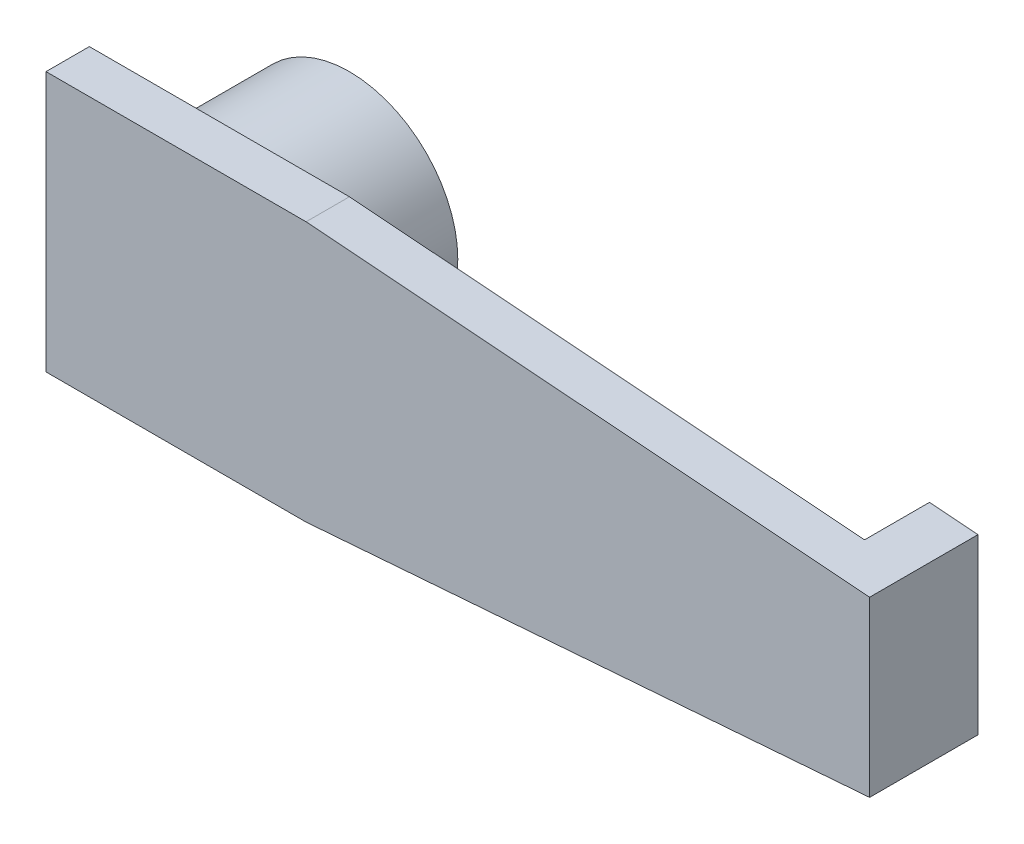
ISO-10303-21;
HEADER;
FILE_DESCRIPTION(('STEP AP214'),'2;1');
FILE_NAME('part.step','',(''),(''),'','','');
FILE_SCHEMA(('AUTOMOTIVE_DESIGN { 1 0 10303 214 1 1 1 1 }'));
ENDSEC;
DATA;
#1=APPLICATION_CONTEXT('core data for automotive mechanical design processes');
#2=APPLICATION_PROTOCOL_DEFINITION('international standard','automotive_design',2000,#1);
#3=PRODUCT_CONTEXT('',#1,'mechanical');
#4=PRODUCT('Part','Part','',(#3));
#5=PRODUCT_RELATED_PRODUCT_CATEGORY('part','',(#4));
#6=PRODUCT_DEFINITION_FORMATION('','',#4);
#7=PRODUCT_DEFINITION_CONTEXT('part definition',#1,'design');
#8=PRODUCT_DEFINITION('design','',#6,#7);
#9=PRODUCT_DEFINITION_SHAPE('','',#8);
#10=(LENGTH_UNIT() NAMED_UNIT(*) SI_UNIT(.MILLI.,.METRE.));
#11=(NAMED_UNIT(*) PLANE_ANGLE_UNIT() SI_UNIT($,.RADIAN.));
#12=(NAMED_UNIT(*) SI_UNIT($,.STERADIAN.) SOLID_ANGLE_UNIT());
#13=UNCERTAINTY_MEASURE_WITH_UNIT(LENGTH_MEASURE(1.E-05),#10,'distance_accuracy_value','');
#14=(GEOMETRIC_REPRESENTATION_CONTEXT(3) GLOBAL_UNCERTAINTY_ASSIGNED_CONTEXT((#13)) GLOBAL_UNIT_ASSIGNED_CONTEXT((#10,
#11,#12)) REPRESENTATION_CONTEXT('',''));
#15=CARTESIAN_POINT('',(0.,0.,0.));
#16=DIRECTION('',(0.,0.,1.));
#17=DIRECTION('',(1.,0.,0.));
#18=AXIS2_PLACEMENT_3D('',#15,#16,#17);
#19=CARTESIAN_POINT('',(0.,0.,15.));
#20=DIRECTION('',(0.,0.,1.));
#21=DIRECTION('',(1.,0.,0.));
#22=AXIS2_PLACEMENT_3D('',#19,#20,#21);
#23=PLANE('',#22);
#24=CARTESIAN_POINT('',(0.,0.,15.));
#25=DIRECTION('',(0.,0.,1.));
#26=DIRECTION('',(1.,0.,0.));
#27=AXIS2_PLACEMENT_3D('',#24,#25,#26);
#28=CIRCLE('',#27,12.5);
#29=CARTESIAN_POINT('',(12.5,0.,15.));
#30=VERTEX_POINT('',#29);
#31=EDGE_CURVE('E12',#30,#30,#28,.T.);
#32=ORIENTED_EDGE('',*,*,#31,.T.);
#33=EDGE_LOOP('',(#32));
#34=FACE_BOUND('',#33,.T.);
#35=DIRECTION('',(0.,1.,0.));
#36=VECTOR('',#35,1.);
#37=CARTESIAN_POINT('',(74.407472360814,10.4301944337835,15.));
#38=LINE('',#37,#36);
#39=CARTESIAN_POINT('',(74.407472360814,-10.4301944337835,15.));
#40=VERTEX_POINT('',#39);
#41=CARTESIAN_POINT('',(74.407472360814,10.4301944337835,15.));
#42=VERTEX_POINT('',#41);
#43=EDGE_CURVE('E366',#40,#42,#38,.T.);
#44=ORIENTED_EDGE('',*,*,#43,.F.);
#45=DIRECTION('',(0.997054485501581,0.0766964988847371,0.));
#46=VECTOR('',#45,1.);
#47=CARTESIAN_POINT('',(15.,-15.,15.));
#48=LINE('',#47,#46);
#49=CARTESIAN_POINT('',(15.0000000000003,-15.,15.));
#50=VERTEX_POINT('',#49);
#51=EDGE_CURVE('E170',#50,#40,#48,.T.);
#52=ORIENTED_EDGE('',*,*,#51,.F.);
#53=DIRECTION('',(1.,0.,0.));
#54=VECTOR('',#53,1.);
#55=CARTESIAN_POINT('',(-15.,-15.,15.));
#56=LINE('',#55,#54);
#57=CARTESIAN_POINT('',(-15.,-15.,15.));
#58=VERTEX_POINT('',#57);
#59=EDGE_CURVE('E103',#58,#50,#56,.T.);
#60=ORIENTED_EDGE('',*,*,#59,.F.);
#61=DIRECTION('',(0.,-1.,0.));
#62=VECTOR('',#61,1.);
#63=CARTESIAN_POINT('',(-15.,15.,15.));
#64=LINE('',#63,#62);
#65=CARTESIAN_POINT('',(-15.,15.,15.));
#66=VERTEX_POINT('',#65);
#67=EDGE_CURVE('E151',#66,#58,#64,.T.);
#68=ORIENTED_EDGE('',*,*,#67,.F.);
#69=DIRECTION('',(-1.,0.,0.));
#70=VECTOR('',#69,1.);
#71=CARTESIAN_POINT('',(-15.,15.,15.));
#72=LINE('',#71,#70);
#73=CARTESIAN_POINT('',(15.0000000000005,15.,15.));
#74=VERTEX_POINT('',#73);
#75=EDGE_CURVE('E248',#74,#66,#72,.T.);
#76=ORIENTED_EDGE('',*,*,#75,.F.);
#77=DIRECTION('',(0.997054485501581,-0.076696498884737,0.));
#78=VECTOR('',#77,1.);
#79=CARTESIAN_POINT('',(15.,15.,15.));
#80=LINE('',#79,#78);
#81=EDGE_CURVE('E162',#74,#42,#80,.T.);
#82=ORIENTED_EDGE('',*,*,#81,.T.);
#83=EDGE_LOOP('',(#44,#52,#60,#68,#76,#82));
#84=FACE_BOUND('',#83,.T.);
#85=ADVANCED_FACE('F49',(#34,#84),#23,.F.);
#86=CARTESIAN_POINT('',(0.,0.,15.));
#87=DIRECTION('',(0.,0.,-1.));
#88=DIRECTION('',(-1.,0.,0.));
#89=AXIS2_PLACEMENT_3D('',#86,#87,#88);
#90=CYLINDRICAL_SURFACE('',#89,12.5);
#91=ORIENTED_EDGE('',*,*,#31,.F.);
#92=EDGE_LOOP('',(#91));
#93=FACE_BOUND('',#92,.T.);
#94=CARTESIAN_POINT('',(0.,0.,0.));
#95=DIRECTION('',(0.,0.,1.));
#96=DIRECTION('',(1.,0.,0.));
#97=AXIS2_PLACEMENT_3D('',#94,#95,#96);
#98=CIRCLE('',#97,12.5);
#99=CARTESIAN_POINT('',(12.5,0.,0.));
#100=VERTEX_POINT('',#99);
#101=EDGE_CURVE('E60',#100,#100,#98,.T.);
#102=ORIENTED_EDGE('',*,*,#101,.T.);
#103=EDGE_LOOP('',(#102));
#104=FACE_BOUND('',#103,.T.);
#105=ADVANCED_FACE('F51',(#93,#104),#90,.T.);
#106=CARTESIAN_POINT('',(0.,0.,0.));
#107=DIRECTION('',(0.,0.,1.));
#108=DIRECTION('',(1.,0.,0.));
#109=AXIS2_PLACEMENT_3D('',#106,#107,#108);
#110=PLANE('',#109);
#111=DIRECTION('',(-1.,0.,0.));
#112=VECTOR('',#111,1.);
#113=CARTESIAN_POINT('',(5.,-5.,0.));
#114=LINE('',#113,#112);
#115=CARTESIAN_POINT('',(5.,-5.,0.));
#116=VERTEX_POINT('',#115);
#117=CARTESIAN_POINT('',(-5.,-5.,0.));
#118=VERTEX_POINT('',#117);
#119=EDGE_CURVE('E301',#116,#118,#114,.T.);
#120=ORIENTED_EDGE('',*,*,#119,.F.);
#121=DIRECTION('',(0.,-1.,0.));
#122=VECTOR('',#121,1.);
#123=CARTESIAN_POINT('',(5.,5.,0.));
#124=LINE('',#123,#122);
#125=CARTESIAN_POINT('',(5.,5.,0.));
#126=VERTEX_POINT('',#125);
#127=EDGE_CURVE('E68',#126,#116,#124,.T.);
#128=ORIENTED_EDGE('',*,*,#127,.F.);
#129=DIRECTION('',(1.,0.,0.));
#130=VECTOR('',#129,1.);
#131=CARTESIAN_POINT('',(5.,5.,0.));
#132=LINE('',#131,#130);
#133=CARTESIAN_POINT('',(-5.,5.,0.));
#134=VERTEX_POINT('',#133);
#135=EDGE_CURVE('E333',#134,#126,#132,.T.);
#136=ORIENTED_EDGE('',*,*,#135,.F.);
#137=DIRECTION('',(0.,1.,0.));
#138=VECTOR('',#137,1.);
#139=CARTESIAN_POINT('',(-5.,5.,0.));
#140=LINE('',#139,#138);
#141=EDGE_CURVE('E349',#118,#134,#140,.T.);
#142=ORIENTED_EDGE('',*,*,#141,.F.);
#143=EDGE_LOOP('',(#120,#128,#136,#142));
#144=FACE_BOUND('',#143,.T.);
#145=ORIENTED_EDGE('',*,*,#101,.F.);
#146=EDGE_LOOP('',(#145));
#147=FACE_BOUND('',#146,.T.);
#148=ADVANCED_FACE('F397',(#144,#147),#110,.F.);
#149=CARTESIAN_POINT('',(-15.,15.,20.));
#150=DIRECTION('',(1.,0.,0.));
#151=DIRECTION('',(0.,0.,-1.));
#152=AXIS2_PLACEMENT_3D('',#149,#150,#151);
#153=PLANE('',#152);
#154=ORIENTED_EDGE('',*,*,#67,.T.);
#155=DIRECTION('',(0.,0.,-1.));
#156=VECTOR('',#155,1.);
#157=CARTESIAN_POINT('',(-15.,-15.,20.));
#158=LINE('',#157,#156);
#159=CARTESIAN_POINT('',(-15.,-15.,20.));
#160=VERTEX_POINT('',#159);
#161=EDGE_CURVE('E256',#160,#58,#158,.T.);
#162=ORIENTED_EDGE('',*,*,#161,.F.);
#163=DIRECTION('',(0.,-1.,0.));
#164=VECTOR('',#163,1.);
#165=CARTESIAN_POINT('',(-15.,15.,20.));
#166=LINE('',#165,#164);
#167=CARTESIAN_POINT('',(-15.,15.,20.));
#168=VERTEX_POINT('',#167);
#169=EDGE_CURVE('E239',#168,#160,#166,.T.);
#170=ORIENTED_EDGE('',*,*,#169,.F.);
#171=DIRECTION('',(0.,0.,-1.));
#172=VECTOR('',#171,1.);
#173=CARTESIAN_POINT('',(-15.,15.,20.));
#174=LINE('',#173,#172);
#175=EDGE_CURVE('E252',#168,#66,#174,.T.);
#176=ORIENTED_EDGE('',*,*,#175,.T.);
#177=EDGE_LOOP('',(#154,#162,#170,#176));
#178=FACE_BOUND('',#177,.T.);
#179=ADVANCED_FACE('F277',(#178),#153,.F.);
#180=CARTESIAN_POINT('',(-15.,-15.,20.));
#181=DIRECTION('',(0.,1.,0.));
#182=DIRECTION('',(-1.,0.,0.));
#183=AXIS2_PLACEMENT_3D('',#180,#181,#182);
#184=PLANE('',#183);
#185=ORIENTED_EDGE('',*,*,#59,.T.);
#186=DIRECTION('',(0.,0.,1.));
#187=VECTOR('',#186,1.);
#188=CARTESIAN_POINT('',(15.,-15.,0.));
#189=LINE('',#188,#187);
#190=CARTESIAN_POINT('',(15.0000000000003,-15.,20.));
#191=VERTEX_POINT('',#190);
#192=EDGE_CURVE('E258',#191,#50,#189,.F.);
#193=ORIENTED_EDGE('',*,*,#192,.F.);
#194=DIRECTION('',(1.,0.,0.));
#195=VECTOR('',#194,1.);
#196=CARTESIAN_POINT('',(-15.,-15.,20.));
#197=LINE('',#196,#195);
#198=EDGE_CURVE('E247',#160,#191,#197,.T.);
#199=ORIENTED_EDGE('',*,*,#198,.F.);
#200=ORIENTED_EDGE('',*,*,#161,.T.);
#201=EDGE_LOOP('',(#185,#193,#199,#200));
#202=FACE_BOUND('',#201,.T.);
#203=ADVANCED_FACE('F282',(#202),#184,.F.);
#204=CARTESIAN_POINT('',(-15.,15.,20.));
#205=DIRECTION('',(0.,-1.,0.));
#206=DIRECTION('',(1.,0.,0.));
#207=AXIS2_PLACEMENT_3D('',#204,#205,#206);
#208=PLANE('',#207);
#209=ORIENTED_EDGE('',*,*,#75,.T.);
#210=ORIENTED_EDGE('',*,*,#175,.F.);
#211=DIRECTION('',(-1.,0.,0.));
#212=VECTOR('',#211,1.);
#213=CARTESIAN_POINT('',(-15.,15.,20.));
#214=LINE('',#213,#212);
#215=CARTESIAN_POINT('',(15.0000000000005,15.,20.));
#216=VERTEX_POINT('',#215);
#217=EDGE_CURVE('E77',#216,#168,#214,.T.);
#218=ORIENTED_EDGE('',*,*,#217,.F.);
#219=DIRECTION('',(0.,0.,1.));
#220=VECTOR('',#219,1.);
#221=CARTESIAN_POINT('',(15.,15.,20.));
#222=LINE('',#221,#220);
#223=EDGE_CURVE('E168',#216,#74,#222,.F.);
#224=ORIENTED_EDGE('',*,*,#223,.T.);
#225=EDGE_LOOP('',(#209,#210,#218,#224));
#226=FACE_BOUND('',#225,.T.);
#227=ADVANCED_FACE('F271',(#226),#208,.F.);
#228=CARTESIAN_POINT('',(0.,0.,20.));
#229=DIRECTION('',(0.,0.,1.));
#230=DIRECTION('',(1.,0.,0.));
#231=AXIS2_PLACEMENT_3D('',#228,#229,#230);
#232=PLANE('',#231);
#233=ORIENTED_EDGE('',*,*,#169,.T.);
#234=ORIENTED_EDGE('',*,*,#198,.T.);
#235=DIRECTION('',(0.997054485501581,0.0766964988847371,0.));
#236=VECTOR('',#235,1.);
#237=CARTESIAN_POINT('',(15.,-15.,20.));
#238=LINE('',#237,#236);
#239=CARTESIAN_POINT('',(80.,-10.,20.));
#240=VERTEX_POINT('',#239);
#241=EDGE_CURVE('E160',#191,#240,#238,.T.);
#242=ORIENTED_EDGE('',*,*,#241,.T.);
#243=DIRECTION('',(0.,-1.,0.));
#244=VECTOR('',#243,1.);
#245=CARTESIAN_POINT('',(80.,10.,20.));
#246=LINE('',#245,#244);
#247=CARTESIAN_POINT('',(80.,10.,20.));
#248=VERTEX_POINT('',#247);
#249=EDGE_CURVE('E141',#248,#240,#246,.T.);
#250=ORIENTED_EDGE('',*,*,#249,.F.);
#251=DIRECTION('',(0.997054485501581,-0.076696498884737,0.));
#252=VECTOR('',#251,1.);
#253=CARTESIAN_POINT('',(15.,15.,20.));
#254=LINE('',#253,#252);
#255=EDGE_CURVE('E157',#216,#248,#254,.T.);
#256=ORIENTED_EDGE('',*,*,#255,.F.);
#257=ORIENTED_EDGE('',*,*,#217,.T.);
#258=EDGE_LOOP('',(#233,#234,#242,#250,#256,#257));
#259=FACE_BOUND('',#258,.T.);
#260=ADVANCED_FACE('F156',(#259),#232,.T.);
#261=CARTESIAN_POINT('',(80.,0.,0.));
#262=DIRECTION('',(1.,0.,0.));
#263=DIRECTION('',(0.,0.,-1.));
#264=AXIS2_PLACEMENT_3D('',#261,#262,#263);
#265=PLANE('',#264);
#266=ORIENTED_EDGE('',*,*,#249,.T.);
#267=DIRECTION('',(0.,0.,-1.));
#268=VECTOR('',#267,1.);
#269=CARTESIAN_POINT('',(80.,-10.,20.));
#270=LINE('',#269,#268);
#271=CARTESIAN_POINT('',(80.,-10.,15.));
#272=VERTEX_POINT('',#271);
#273=EDGE_CURVE('E152',#240,#272,#270,.T.);
#274=ORIENTED_EDGE('',*,*,#273,.T.);
#275=DIRECTION('',(0.,0.,1.));
#276=VECTOR('',#275,1.);
#277=CARTESIAN_POINT('',(80.,-10.,7.5));
#278=LINE('',#277,#276);
#279=CARTESIAN_POINT('',(80.,-10.,7.5));
#280=VERTEX_POINT('',#279);
#281=EDGE_CURVE('E287',#280,#272,#278,.T.);
#282=ORIENTED_EDGE('',*,*,#281,.F.);
#283=DIRECTION('',(0.,-1.,0.));
#284=VECTOR('',#283,1.);
#285=CARTESIAN_POINT('',(80.,-10.,7.5));
#286=LINE('',#285,#284);
#287=CARTESIAN_POINT('',(80.,10.,7.5));
#288=VERTEX_POINT('',#287);
#289=EDGE_CURVE('E527',#288,#280,#286,.T.);
#290=ORIENTED_EDGE('',*,*,#289,.F.);
#291=DIRECTION('',(0.,0.,1.));
#292=VECTOR('',#291,1.);
#293=CARTESIAN_POINT('',(80.,10.,7.5));
#294=LINE('',#293,#292);
#295=CARTESIAN_POINT('',(80.,10.,15.));
#296=VERTEX_POINT('',#295);
#297=EDGE_CURVE('E146',#288,#296,#294,.T.);
#298=ORIENTED_EDGE('',*,*,#297,.T.);
#299=DIRECTION('',(0.,0.,1.));
#300=VECTOR('',#299,1.);
#301=CARTESIAN_POINT('',(80.,10.,20.));
#302=LINE('',#301,#300);
#303=EDGE_CURVE('E53',#296,#248,#302,.T.);
#304=ORIENTED_EDGE('',*,*,#303,.T.);
#305=EDGE_LOOP('',(#266,#274,#282,#290,#298,#304));
#306=FACE_BOUND('',#305,.T.);
#307=ADVANCED_FACE('F139',(#306),#265,.T.);
#308=CARTESIAN_POINT('',(1.23529411764706,16.0588235294118,0.));
#309=DIRECTION('',(-0.076696498884737,-0.997054485501582,0.));
#310=DIRECTION('',(0.997054485501582,-0.076696498884737,0.));
#311=AXIS2_PLACEMENT_3D('',#308,#309,#310);
#312=PLANE('',#311);
#313=ORIENTED_EDGE('',*,*,#255,.T.);
#314=ORIENTED_EDGE('',*,*,#303,.F.);
#315=ORIENTED_EDGE('',*,*,#297,.F.);
#316=DIRECTION('',(0.997054485501582,-0.0766964988847371,0.));
#317=VECTOR('',#316,1.);
#318=CARTESIAN_POINT('',(80.,10.,7.5));
#319=LINE('',#318,#317);
#320=CARTESIAN_POINT('',(74.407472360814,10.4301944337835,7.5));
#321=VERTEX_POINT('',#320);
#322=EDGE_CURVE('E372',#321,#288,#319,.T.);
#323=ORIENTED_EDGE('',*,*,#322,.F.);
#324=DIRECTION('',(0.,0.,1.));
#325=VECTOR('',#324,1.);
#326=CARTESIAN_POINT('',(74.407472360814,10.4301944337835,7.5));
#327=LINE('',#326,#325);
#328=EDGE_CURVE('E306',#321,#42,#327,.T.);
#329=ORIENTED_EDGE('',*,*,#328,.T.);
#330=ORIENTED_EDGE('',*,*,#81,.F.);
#331=ORIENTED_EDGE('',*,*,#223,.F.);
#332=EDGE_LOOP('',(#313,#314,#315,#323,#329,#330,#331));
#333=FACE_BOUND('',#332,.T.);
#334=ADVANCED_FACE('F166',(#333),#312,.F.);
#335=CARTESIAN_POINT('',(1.23529411764706,-16.0588235294118,0.));
#336=DIRECTION('',(-0.0766964988847371,0.997054485501582,0.));
#337=DIRECTION('',(-0.997054485501582,-0.0766964988847371,0.));
#338=AXIS2_PLACEMENT_3D('',#335,#336,#337);
#339=PLANE('',#338);
#340=ORIENTED_EDGE('',*,*,#51,.T.);
#341=DIRECTION('',(0.,0.,1.));
#342=VECTOR('',#341,1.);
#343=CARTESIAN_POINT('',(74.407472360814,-10.4301944337835,7.5));
#344=LINE('',#343,#342);
#345=CARTESIAN_POINT('',(74.407472360814,-10.4301944337835,7.5));
#346=VERTEX_POINT('',#345);
#347=EDGE_CURVE('E303',#346,#40,#344,.T.);
#348=ORIENTED_EDGE('',*,*,#347,.F.);
#349=DIRECTION('',(-0.997054485501581,-0.0766964988847378,0.));
#350=VECTOR('',#349,1.);
#351=CARTESIAN_POINT('',(74.407472360814,-10.4301944337835,7.5));
#352=LINE('',#351,#350);
#353=EDGE_CURVE('E533',#280,#346,#352,.T.);
#354=ORIENTED_EDGE('',*,*,#353,.F.);
#355=ORIENTED_EDGE('',*,*,#281,.T.);
#356=ORIENTED_EDGE('',*,*,#273,.F.);
#357=ORIENTED_EDGE('',*,*,#241,.F.);
#358=ORIENTED_EDGE('',*,*,#192,.T.);
#359=EDGE_LOOP('',(#340,#348,#354,#355,#356,#357,#358));
#360=FACE_BOUND('',#359,.T.);
#361=ADVANCED_FACE('F201',(#360),#339,.F.);
#362=CARTESIAN_POINT('',(5.,5.,15.));
#363=DIRECTION('',(1.,0.,0.));
#364=DIRECTION('',(0.,1.,0.));
#365=AXIS2_PLACEMENT_3D('',#362,#363,#364);
#366=PLANE('',#365);
#367=ORIENTED_EDGE('',*,*,#127,.T.);
#368=DIRECTION('',(0.,0.,-1.));
#369=VECTOR('',#368,1.);
#370=CARTESIAN_POINT('',(5.,-5.,15.));
#371=LINE('',#370,#369);
#372=CARTESIAN_POINT('',(5.,-5.,15.));
#373=VERTEX_POINT('',#372);
#374=EDGE_CURVE('E344',#373,#116,#371,.T.);
#375=ORIENTED_EDGE('',*,*,#374,.F.);
#376=DIRECTION('',(0.,-1.,0.));
#377=VECTOR('',#376,1.);
#378=CARTESIAN_POINT('',(5.,5.,15.));
#379=LINE('',#378,#377);
#380=CARTESIAN_POINT('',(5.,5.,15.));
#381=VERTEX_POINT('',#380);
#382=EDGE_CURVE('E328',#381,#373,#379,.T.);
#383=ORIENTED_EDGE('',*,*,#382,.F.);
#384=DIRECTION('',(0.,0.,-1.));
#385=VECTOR('',#384,1.);
#386=CARTESIAN_POINT('',(5.,5.,15.));
#387=LINE('',#386,#385);
#388=EDGE_CURVE('E114',#381,#126,#387,.T.);
#389=ORIENTED_EDGE('',*,*,#388,.T.);
#390=EDGE_LOOP('',(#367,#375,#383,#389));
#391=FACE_BOUND('',#390,.T.);
#392=ADVANCED_FACE('F202',(#391),#366,.F.);
#393=CARTESIAN_POINT('',(5.,5.,15.));
#394=DIRECTION('',(0.,1.,0.));
#395=DIRECTION('',(-1.,0.,0.));
#396=AXIS2_PLACEMENT_3D('',#393,#394,#395);
#397=PLANE('',#396);
#398=ORIENTED_EDGE('',*,*,#135,.T.);
#399=ORIENTED_EDGE('',*,*,#388,.F.);
#400=DIRECTION('',(1.,0.,0.));
#401=VECTOR('',#400,1.);
#402=CARTESIAN_POINT('',(5.,5.,15.));
#403=LINE('',#402,#401);
#404=CARTESIAN_POINT('',(-5.,5.,15.));
#405=VERTEX_POINT('',#404);
#406=EDGE_CURVE('E341',#405,#381,#403,.T.);
#407=ORIENTED_EDGE('',*,*,#406,.F.);
#408=DIRECTION('',(0.,0.,-1.));
#409=VECTOR('',#408,1.);
#410=CARTESIAN_POINT('',(-5.,5.,15.));
#411=LINE('',#410,#409);
#412=EDGE_CURVE('E357',#405,#134,#411,.T.);
#413=ORIENTED_EDGE('',*,*,#412,.T.);
#414=EDGE_LOOP('',(#398,#399,#407,#413));
#415=FACE_BOUND('',#414,.T.);
#416=ADVANCED_FACE('F400',(#415),#397,.F.);
#417=CARTESIAN_POINT('',(-5.,5.,15.));
#418=DIRECTION('',(-1.,0.,0.));
#419=DIRECTION('',(0.,0.,1.));
#420=AXIS2_PLACEMENT_3D('',#417,#418,#419);
#421=PLANE('',#420);
#422=ORIENTED_EDGE('',*,*,#141,.T.);
#423=ORIENTED_EDGE('',*,*,#412,.F.);
#424=DIRECTION('',(0.,1.,0.));
#425=VECTOR('',#424,1.);
#426=CARTESIAN_POINT('',(-5.,5.,15.));
#427=LINE('',#426,#425);
#428=CARTESIAN_POINT('',(-5.,-5.,15.));
#429=VERTEX_POINT('',#428);
#430=EDGE_CURVE('E337',#429,#405,#427,.T.);
#431=ORIENTED_EDGE('',*,*,#430,.F.);
#432=DIRECTION('',(0.,0.,-1.));
#433=VECTOR('',#432,1.);
#434=CARTESIAN_POINT('',(-5.,-5.,15.));
#435=LINE('',#434,#433);
#436=EDGE_CURVE('E360',#429,#118,#435,.T.);
#437=ORIENTED_EDGE('',*,*,#436,.T.);
#438=EDGE_LOOP('',(#422,#423,#431,#437));
#439=FACE_BOUND('',#438,.T.);
#440=ADVANCED_FACE('F393',(#439),#421,.F.);
#441=CARTESIAN_POINT('',(5.,-5.,15.));
#442=DIRECTION('',(0.,-1.,0.));
#443=DIRECTION('',(1.,0.,0.));
#444=AXIS2_PLACEMENT_3D('',#441,#442,#443);
#445=PLANE('',#444);
#446=ORIENTED_EDGE('',*,*,#119,.T.);
#447=ORIENTED_EDGE('',*,*,#436,.F.);
#448=DIRECTION('',(-1.,0.,0.));
#449=VECTOR('',#448,1.);
#450=CARTESIAN_POINT('',(5.,-5.,15.));
#451=LINE('',#450,#449);
#452=EDGE_CURVE('E332',#373,#429,#451,.T.);
#453=ORIENTED_EDGE('',*,*,#452,.F.);
#454=ORIENTED_EDGE('',*,*,#374,.T.);
#455=EDGE_LOOP('',(#446,#447,#453,#454));
#456=FACE_BOUND('',#455,.T.);
#457=ADVANCED_FACE('F389',(#456),#445,.F.);
#458=CARTESIAN_POINT('',(0.,0.,15.));
#459=DIRECTION('',(0.,0.,-1.));
#460=DIRECTION('',(-1.,0.,0.));
#461=AXIS2_PLACEMENT_3D('',#458,#459,#460);
#462=PLANE('',#461);
#463=ORIENTED_EDGE('',*,*,#382,.T.);
#464=ORIENTED_EDGE('',*,*,#452,.T.);
#465=ORIENTED_EDGE('',*,*,#430,.T.);
#466=ORIENTED_EDGE('',*,*,#406,.T.);
#467=EDGE_LOOP('',(#463,#464,#465,#466));
#468=FACE_BOUND('',#467,.T.);
#469=ADVANCED_FACE('F395',(#468),#462,.T.);
#470=CARTESIAN_POINT('',(74.407472360814,10.4301944337835,7.5));
#471=DIRECTION('',(1.,0.,0.));
#472=DIRECTION('',(0.,0.,-1.));
#473=AXIS2_PLACEMENT_3D('',#470,#471,#472);
#474=PLANE('',#473);
#475=ORIENTED_EDGE('',*,*,#43,.T.);
#476=ORIENTED_EDGE('',*,*,#328,.F.);
#477=DIRECTION('',(0.,1.,0.));
#478=VECTOR('',#477,1.);
#479=CARTESIAN_POINT('',(74.407472360814,10.4301944337835,7.5));
#480=LINE('',#479,#478);
#481=EDGE_CURVE('E324',#346,#321,#480,.T.);
#482=ORIENTED_EDGE('',*,*,#481,.F.);
#483=ORIENTED_EDGE('',*,*,#347,.T.);
#484=EDGE_LOOP('',(#475,#476,#482,#483));
#485=FACE_BOUND('',#484,.T.);
#486=ADVANCED_FACE('F373',(#485),#474,.F.);
#487=CARTESIAN_POINT('',(0.,0.,7.5));
#488=DIRECTION('',(0.,0.,1.));
#489=DIRECTION('',(1.,0.,0.));
#490=AXIS2_PLACEMENT_3D('',#487,#488,#489);
#491=PLANE('',#490);
#492=ORIENTED_EDGE('',*,*,#322,.T.);
#493=ORIENTED_EDGE('',*,*,#289,.T.);
#494=ORIENTED_EDGE('',*,*,#353,.T.);
#495=ORIENTED_EDGE('',*,*,#481,.T.);
#496=EDGE_LOOP('',(#492,#493,#494,#495));
#497=FACE_BOUND('',#496,.T.);
#498=ADVANCED_FACE('F515',(#497),#491,.F.);
#499=CLOSED_SHELL('',(#85,#105,#148,#179,#203,#227,#260,#307,#334,#361,#392,#416,#440,#457,#469,
#486,#498));
#500=MANIFOLD_SOLID_BREP('B2',#499);
#501=ADVANCED_BREP_SHAPE_REPRESENTATION('',(#18,#500),#14);
#502=SHAPE_DEFINITION_REPRESENTATION(#9,#501);
ENDSEC;
END-ISO-10303-21;
